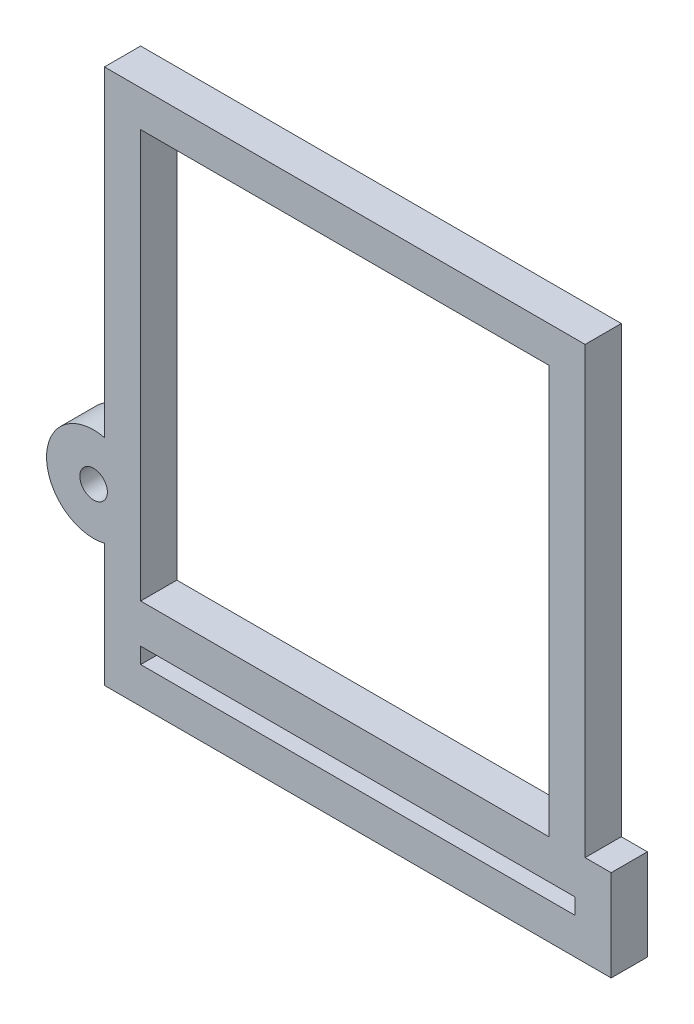
ISO-10303-21;
HEADER;
FILE_DESCRIPTION(('STEP AP214'),'2;1');
FILE_NAME('part.step','',(''),(''),'','','');
FILE_SCHEMA(('AUTOMOTIVE_DESIGN { 1 0 10303 214 1 1 1 1 }'));
ENDSEC;
DATA;
#1=APPLICATION_CONTEXT('core data for automotive mechanical design processes');
#2=APPLICATION_PROTOCOL_DEFINITION('international standard','automotive_design',2000,#1);
#3=PRODUCT_CONTEXT('',#1,'mechanical');
#4=PRODUCT('Part','Part','',(#3));
#5=PRODUCT_RELATED_PRODUCT_CATEGORY('part','',(#4));
#6=PRODUCT_DEFINITION_FORMATION('','',#4);
#7=PRODUCT_DEFINITION_CONTEXT('part definition',#1,'design');
#8=PRODUCT_DEFINITION('design','',#6,#7);
#9=PRODUCT_DEFINITION_SHAPE('','',#8);
#10=(LENGTH_UNIT() NAMED_UNIT(*) SI_UNIT(.MILLI.,.METRE.));
#11=(NAMED_UNIT(*) PLANE_ANGLE_UNIT() SI_UNIT($,.RADIAN.));
#12=(NAMED_UNIT(*) SI_UNIT($,.STERADIAN.) SOLID_ANGLE_UNIT());
#13=UNCERTAINTY_MEASURE_WITH_UNIT(LENGTH_MEASURE(1.E-05),#10,'distance_accuracy_value','');
#14=(GEOMETRIC_REPRESENTATION_CONTEXT(3) GLOBAL_UNCERTAINTY_ASSIGNED_CONTEXT((#13)) GLOBAL_UNIT_ASSIGNED_CONTEXT((#10,
#11,#12)) REPRESENTATION_CONTEXT('',''));
#15=CARTESIAN_POINT('',(0.,0.,0.));
#16=DIRECTION('',(0.,0.,1.));
#17=DIRECTION('',(1.,0.,0.));
#18=AXIS2_PLACEMENT_3D('',#15,#16,#17);
#19=CARTESIAN_POINT('',(0.,0.,5.));
#20=DIRECTION('',(1.,0.,0.));
#21=DIRECTION('',(0.,1.,0.));
#22=AXIS2_PLACEMENT_3D('',#19,#20,#21);
#23=PLANE('',#22);
#24=DIRECTION('',(0.,-1.,0.));
#25=VECTOR('',#24,1.);
#26=CARTESIAN_POINT('',(0.,0.,0.));
#27=LINE('',#26,#25);
#28=CARTESIAN_POINT('',(0.,74.,0.));
#29=VERTEX_POINT('',#28);
#30=CARTESIAN_POINT('',(0.,29.6536509361899,0.));
#31=VERTEX_POINT('',#30);
#32=EDGE_CURVE('E158',#29,#31,#27,.T.);
#33=ORIENTED_EDGE('',*,*,#32,.T.);
#34=DIRECTION('',(0.,0.,1.));
#35=VECTOR('',#34,1.);
#36=CARTESIAN_POINT('',(0.,29.6536509361899,-18.3847763108502));
#37=LINE('',#36,#35);
#38=CARTESIAN_POINT('',(0.,29.6536509361899,5.));
#39=VERTEX_POINT('',#38);
#40=EDGE_CURVE('E145',#31,#39,#37,.T.);
#41=ORIENTED_EDGE('',*,*,#40,.T.);
#42=DIRECTION('',(0.,-1.,0.));
#43=VECTOR('',#42,1.);
#44=CARTESIAN_POINT('',(0.,0.,5.));
#45=LINE('',#44,#43);
#46=CARTESIAN_POINT('',(0.,74.,5.));
#47=VERTEX_POINT('',#46);
#48=EDGE_CURVE('E156',#47,#39,#45,.T.);
#49=ORIENTED_EDGE('',*,*,#48,.F.);
#50=DIRECTION('',(0.,0.,-1.));
#51=VECTOR('',#50,1.);
#52=CARTESIAN_POINT('',(0.,74.,5.));
#53=LINE('',#52,#51);
#54=EDGE_CURVE('E180',#47,#29,#53,.T.);
#55=ORIENTED_EDGE('',*,*,#54,.T.);
#56=EDGE_LOOP('',(#33,#41,#49,#55));
#57=FACE_BOUND('',#56,.T.);
#58=ADVANCED_FACE('F31',(#57),#23,.F.);
#59=CARTESIAN_POINT('',(0.,17.0045402955164,5.));
#60=VERTEX_POINT('',#59);
#61=CARTESIAN_POINT('',(0.,0.,5.));
#62=VERTEX_POINT('',#61);
#63=EDGE_CURVE('E168',#60,#62,#45,.T.);
#64=ORIENTED_EDGE('',*,*,#63,.F.);
#65=DIRECTION('',(0.,0.,1.));
#66=VECTOR('',#65,1.);
#67=CARTESIAN_POINT('',(0.,17.0045402955164,-18.3847763108502));
#68=LINE('',#67,#66);
#69=CARTESIAN_POINT('',(0.,17.0045402955164,0.));
#70=VERTEX_POINT('',#69);
#71=EDGE_CURVE('E146',#60,#70,#68,.F.);
#72=ORIENTED_EDGE('',*,*,#71,.T.);
#73=CARTESIAN_POINT('',(0.,0.,0.));
#74=VERTEX_POINT('',#73);
#75=EDGE_CURVE('E183',#70,#74,#27,.T.);
#76=ORIENTED_EDGE('',*,*,#75,.T.);
#77=DIRECTION('',(0.,0.,-1.));
#78=VECTOR('',#77,1.);
#79=CARTESIAN_POINT('',(0.,0.,5.));
#80=LINE('',#79,#78);
#81=EDGE_CURVE('E193',#62,#74,#80,.T.);
#82=ORIENTED_EDGE('',*,*,#81,.F.);
#83=EDGE_LOOP('',(#64,#72,#76,#82));
#84=FACE_BOUND('',#83,.T.);
#85=ADVANCED_FACE('F33',(#84),#23,.F.);
#86=CARTESIAN_POINT('',(0.,0.,5.));
#87=DIRECTION('',(0.,1.,0.));
#88=DIRECTION('',(0.,0.,1.));
#89=AXIS2_PLACEMENT_3D('',#86,#87,#88);
#90=PLANE('',#89);
#91=DIRECTION('',(1.,0.,0.));
#92=VECTOR('',#91,1.);
#93=CARTESIAN_POINT('',(0.,0.,0.));
#94=LINE('',#93,#92);
#95=CARTESIAN_POINT('',(70.,0.,0.));
#96=VERTEX_POINT('',#95);
#97=EDGE_CURVE('E182',#74,#96,#94,.T.);
#98=ORIENTED_EDGE('',*,*,#97,.T.);
#99=DIRECTION('',(0.,0.,-1.));
#100=VECTOR('',#99,1.);
#101=CARTESIAN_POINT('',(70.,0.,5.));
#102=LINE('',#101,#100);
#103=CARTESIAN_POINT('',(70.,0.,5.));
#104=VERTEX_POINT('',#103);
#105=EDGE_CURVE('E190',#104,#96,#102,.T.);
#106=ORIENTED_EDGE('',*,*,#105,.F.);
#107=DIRECTION('',(1.,0.,0.));
#108=VECTOR('',#107,1.);
#109=CARTESIAN_POINT('',(0.,0.,5.));
#110=LINE('',#109,#108);
#111=EDGE_CURVE('E167',#62,#104,#110,.T.);
#112=ORIENTED_EDGE('',*,*,#111,.F.);
#113=ORIENTED_EDGE('',*,*,#81,.T.);
#114=EDGE_LOOP('',(#98,#106,#112,#113));
#115=FACE_BOUND('',#114,.T.);
#116=ADVANCED_FACE('F287',(#115),#90,.F.);
#117=CARTESIAN_POINT('',(70.,0.,5.));
#118=DIRECTION('',(-1.,0.,0.));
#119=DIRECTION('',(0.,-1.,0.));
#120=AXIS2_PLACEMENT_3D('',#117,#118,#119);
#121=PLANE('',#120);
#122=DIRECTION('',(0.,1.,0.));
#123=VECTOR('',#122,1.);
#124=CARTESIAN_POINT('',(70.,0.,0.));
#125=LINE('',#124,#123);
#126=CARTESIAN_POINT('',(70.,12.6,0.));
#127=VERTEX_POINT('',#126);
#128=EDGE_CURVE('E185',#96,#127,#125,.T.);
#129=ORIENTED_EDGE('',*,*,#128,.T.);
#130=DIRECTION('',(0.,0.,-1.));
#131=VECTOR('',#130,1.);
#132=CARTESIAN_POINT('',(70.,12.6,5.));
#133=LINE('',#132,#131);
#134=CARTESIAN_POINT('',(70.,12.6,5.));
#135=VERTEX_POINT('',#134);
#136=EDGE_CURVE('E54',#135,#127,#133,.T.);
#137=ORIENTED_EDGE('',*,*,#136,.F.);
#138=DIRECTION('',(0.,1.,0.));
#139=VECTOR('',#138,1.);
#140=CARTESIAN_POINT('',(70.,0.,5.));
#141=LINE('',#140,#139);
#142=EDGE_CURVE('E170',#104,#135,#141,.T.);
#143=ORIENTED_EDGE('',*,*,#142,.F.);
#144=ORIENTED_EDGE('',*,*,#105,.T.);
#145=EDGE_LOOP('',(#129,#137,#143,#144));
#146=FACE_BOUND('',#145,.T.);
#147=ADVANCED_FACE('F292',(#146),#121,.F.);
#148=CARTESIAN_POINT('',(0.,74.,5.));
#149=DIRECTION('',(0.,-1.,0.));
#150=DIRECTION('',(0.,0.,-1.));
#151=AXIS2_PLACEMENT_3D('',#148,#149,#150);
#152=PLANE('',#151);
#153=DIRECTION('',(-1.,0.,0.));
#154=VECTOR('',#153,1.);
#155=CARTESIAN_POINT('',(0.,74.,5.));
#156=LINE('',#155,#154);
#157=CARTESIAN_POINT('',(66.4,74.,5.));
#158=VERTEX_POINT('',#157);
#159=EDGE_CURVE('E165',#158,#47,#156,.T.);
#160=ORIENTED_EDGE('',*,*,#159,.F.);
#161=DIRECTION('',(0.,0.,-1.));
#162=VECTOR('',#161,1.);
#163=CARTESIAN_POINT('',(66.4,74.,5.));
#164=LINE('',#163,#162);
#165=CARTESIAN_POINT('',(66.4,74.,0.));
#166=VERTEX_POINT('',#165);
#167=EDGE_CURVE('E296',#158,#166,#164,.T.);
#168=ORIENTED_EDGE('',*,*,#167,.T.);
#169=DIRECTION('',(-1.,0.,0.));
#170=VECTOR('',#169,1.);
#171=CARTESIAN_POINT('',(0.,74.,0.));
#172=LINE('',#171,#170);
#173=EDGE_CURVE('E172',#166,#29,#172,.T.);
#174=ORIENTED_EDGE('',*,*,#173,.T.);
#175=ORIENTED_EDGE('',*,*,#54,.F.);
#176=EDGE_LOOP('',(#160,#168,#174,#175));
#177=FACE_BOUND('',#176,.T.);
#178=ADVANCED_FACE('F307',(#177),#152,.F.);
#179=CARTESIAN_POINT('',(0.,74.,5.));
#180=DIRECTION('',(0.,0.,-1.));
#181=DIRECTION('',(-1.,0.,0.));
#182=AXIS2_PLACEMENT_3D('',#179,#180,#181);
#183=PLANE('',#182);
#184=CARTESIAN_POINT('',(-1.50000000000004,23.3290956158532,5.));
#185=DIRECTION('',(0.,0.,1.));
#186=DIRECTION('',(1.,0.,0.));
#187=AXIS2_PLACEMENT_3D('',#184,#185,#186);
#188=CIRCLE('',#187,1.9);
#189=CARTESIAN_POINT('',(0.399999999999964,23.3290956158532,5.));
#190=VERTEX_POINT('',#189);
#191=EDGE_CURVE('E150',#190,#190,#188,.T.);
#192=ORIENTED_EDGE('',*,*,#191,.F.);
#193=EDGE_LOOP('',(#192));
#194=FACE_BOUND('',#193,.T.);
#195=DIRECTION('',(1.,0.,0.));
#196=VECTOR('',#195,1.);
#197=CARTESIAN_POINT('',(4.99999999999997,12.6,5.));
#198=LINE('',#197,#196);
#199=CARTESIAN_POINT('',(4.99999999999997,12.6,5.));
#200=VERTEX_POINT('',#199);
#201=CARTESIAN_POINT('',(61.4,12.6,5.));
#202=VERTEX_POINT('',#201);
#203=EDGE_CURVE('E302',#200,#202,#198,.T.);
#204=ORIENTED_EDGE('',*,*,#203,.F.);
#205=DIRECTION('',(0.,-1.,0.));
#206=VECTOR('',#205,1.);
#207=CARTESIAN_POINT('',(4.99999999999996,69.,5.));
#208=LINE('',#207,#206);
#209=CARTESIAN_POINT('',(4.99999999999996,69.,5.));
#210=VERTEX_POINT('',#209);
#211=EDGE_CURVE('E232',#210,#200,#208,.T.);
#212=ORIENTED_EDGE('',*,*,#211,.F.);
#213=DIRECTION('',(-1.,0.,0.));
#214=VECTOR('',#213,1.);
#215=CARTESIAN_POINT('',(4.99999999999996,69.,5.));
#216=LINE('',#215,#214);
#217=CARTESIAN_POINT('',(61.4,69.,5.));
#218=VERTEX_POINT('',#217);
#219=EDGE_CURVE('E233',#218,#210,#216,.T.);
#220=ORIENTED_EDGE('',*,*,#219,.F.);
#221=DIRECTION('',(0.,1.,0.));
#222=VECTOR('',#221,1.);
#223=CARTESIAN_POINT('',(61.4,69.,5.));
#224=LINE('',#223,#222);
#225=EDGE_CURVE('E216',#202,#218,#224,.T.);
#226=ORIENTED_EDGE('',*,*,#225,.F.);
#227=EDGE_LOOP('',(#204,#212,#220,#226));
#228=FACE_BOUND('',#227,.T.);
#229=ORIENTED_EDGE('',*,*,#48,.T.);
#230=CARTESIAN_POINT('',(-1.50000000000004,23.3290956158532,5.));
#231=DIRECTION('',(0.,0.,1.));
#232=DIRECTION('',(1.,0.,0.));
#233=AXIS2_PLACEMENT_3D('',#230,#231,#232);
#234=CIRCLE('',#233,6.5);
#235=EDGE_CURVE('E142',#39,#60,#234,.T.);
#236=ORIENTED_EDGE('',*,*,#235,.T.);
#237=ORIENTED_EDGE('',*,*,#63,.T.);
#238=ORIENTED_EDGE('',*,*,#111,.T.);
#239=ORIENTED_EDGE('',*,*,#142,.T.);
#240=DIRECTION('',(-1.,0.,0.));
#241=VECTOR('',#240,1.);
#242=CARTESIAN_POINT('',(70.,12.6,5.));
#243=LINE('',#242,#241);
#244=CARTESIAN_POINT('',(66.3999999999999,12.6,5.));
#245=VERTEX_POINT('',#244);
#246=EDGE_CURVE('E290',#135,#245,#243,.T.);
#247=ORIENTED_EDGE('',*,*,#246,.T.);
#248=DIRECTION('',(0.,1.,0.));
#249=VECTOR('',#248,1.);
#250=CARTESIAN_POINT('',(66.4,74.,5.));
#251=LINE('',#250,#249);
#252=EDGE_CURVE('E294',#245,#158,#251,.T.);
#253=ORIENTED_EDGE('',*,*,#252,.T.);
#254=ORIENTED_EDGE('',*,*,#159,.T.);
#255=EDGE_LOOP('',(#229,#236,#237,#238,#239,#247,#253,#254));
#256=FACE_BOUND('',#255,.T.);
#257=DIRECTION('',(1.,0.,0.));
#258=VECTOR('',#257,1.);
#259=CARTESIAN_POINT('',(5.,5.,5.));
#260=LINE('',#259,#258);
#261=CARTESIAN_POINT('',(5.,5.,5.));
#262=VERTEX_POINT('',#261);
#263=CARTESIAN_POINT('',(65.,5.,5.));
#264=VERTEX_POINT('',#263);
#265=EDGE_CURVE('E249',#262,#264,#260,.T.);
#266=ORIENTED_EDGE('',*,*,#265,.F.);
#267=DIRECTION('',(0.,-1.,0.));
#268=VECTOR('',#267,1.);
#269=CARTESIAN_POINT('',(5.,7.2,5.));
#270=LINE('',#269,#268);
#271=CARTESIAN_POINT('',(5.,7.2,5.));
#272=VERTEX_POINT('',#271);
#273=EDGE_CURVE('E247',#272,#262,#270,.T.);
#274=ORIENTED_EDGE('',*,*,#273,.F.);
#275=DIRECTION('',(-1.,0.,0.));
#276=VECTOR('',#275,1.);
#277=CARTESIAN_POINT('',(5.,7.2,5.));
#278=LINE('',#277,#276);
#279=CARTESIAN_POINT('',(65.,7.2,5.));
#280=VERTEX_POINT('',#279);
#281=EDGE_CURVE('E255',#280,#272,#278,.T.);
#282=ORIENTED_EDGE('',*,*,#281,.F.);
#283=DIRECTION('',(0.,1.,0.));
#284=VECTOR('',#283,1.);
#285=CARTESIAN_POINT('',(65.,7.2,5.));
#286=LINE('',#285,#284);
#287=EDGE_CURVE('E252',#264,#280,#286,.T.);
#288=ORIENTED_EDGE('',*,*,#287,.F.);
#289=EDGE_LOOP('',(#266,#274,#282,#288));
#290=FACE_BOUND('',#289,.T.);
#291=ADVANCED_FACE('F161',(#194,#228,#256,#290),#183,.F.);
#292=CARTESIAN_POINT('',(0.,74.,0.));
#293=DIRECTION('',(0.,0.,-1.));
#294=DIRECTION('',(-1.,0.,0.));
#295=AXIS2_PLACEMENT_3D('',#292,#293,#294);
#296=PLANE('',#295);
#297=CARTESIAN_POINT('',(-1.50000000000004,23.3290956158532,0.));
#298=DIRECTION('',(0.,0.,-1.));
#299=DIRECTION('',(-1.,0.,0.));
#300=AXIS2_PLACEMENT_3D('',#297,#298,#299);
#301=CIRCLE('',#300,1.9);
#302=CARTESIAN_POINT('',(-3.40000000000004,23.3290956158532,0.));
#303=VERTEX_POINT('',#302);
#304=EDGE_CURVE('E478',#303,#303,#301,.F.);
#305=ORIENTED_EDGE('',*,*,#304,.T.);
#306=EDGE_LOOP('',(#305));
#307=FACE_BOUND('',#306,.T.);
#308=DIRECTION('',(1.,0.,0.));
#309=VECTOR('',#308,1.);
#310=CARTESIAN_POINT('',(0.,69.,0.));
#311=LINE('',#310,#309);
#312=CARTESIAN_POINT('',(4.99999999999996,69.,0.));
#313=VERTEX_POINT('',#312);
#314=CARTESIAN_POINT('',(61.4,69.,0.));
#315=VERTEX_POINT('',#314);
#316=EDGE_CURVE('E39',#313,#315,#311,.T.);
#317=ORIENTED_EDGE('',*,*,#316,.F.);
#318=DIRECTION('',(0.,1.,0.));
#319=VECTOR('',#318,1.);
#320=CARTESIAN_POINT('',(4.99999999999996,74.,0.));
#321=LINE('',#320,#319);
#322=CARTESIAN_POINT('',(4.99999999999997,12.6,0.));
#323=VERTEX_POINT('',#322);
#324=EDGE_CURVE('E11',#323,#313,#321,.T.);
#325=ORIENTED_EDGE('',*,*,#324,.F.);
#326=DIRECTION('',(-1.,0.,0.));
#327=VECTOR('',#326,1.);
#328=CARTESIAN_POINT('',(0.,12.6,0.));
#329=LINE('',#328,#327);
#330=CARTESIAN_POINT('',(61.4,12.6,0.));
#331=VERTEX_POINT('',#330);
#332=EDGE_CURVE('E196',#331,#323,#329,.T.);
#333=ORIENTED_EDGE('',*,*,#332,.F.);
#334=DIRECTION('',(0.,-1.,0.));
#335=VECTOR('',#334,1.);
#336=CARTESIAN_POINT('',(61.4,74.,0.));
#337=LINE('',#336,#335);
#338=EDGE_CURVE('E198',#315,#331,#337,.T.);
#339=ORIENTED_EDGE('',*,*,#338,.F.);
#340=EDGE_LOOP('',(#317,#325,#333,#339));
#341=FACE_BOUND('',#340,.T.);
#342=ORIENTED_EDGE('',*,*,#75,.F.);
#343=CARTESIAN_POINT('',(-1.50000000000004,23.3290956158532,0.));
#344=DIRECTION('',(0.,0.,-1.));
#345=DIRECTION('',(-1.,0.,0.));
#346=AXIS2_PLACEMENT_3D('',#343,#344,#345);
#347=CIRCLE('',#346,6.5);
#348=EDGE_CURVE('E46',#31,#70,#347,.F.);
#349=ORIENTED_EDGE('',*,*,#348,.F.);
#350=ORIENTED_EDGE('',*,*,#32,.F.);
#351=ORIENTED_EDGE('',*,*,#173,.F.);
#352=DIRECTION('',(0.,1.,0.));
#353=VECTOR('',#352,1.);
#354=CARTESIAN_POINT('',(66.4,74.,0.));
#355=LINE('',#354,#353);
#356=CARTESIAN_POINT('',(66.3999999999999,12.6,0.));
#357=VERTEX_POINT('',#356);
#358=EDGE_CURVE('E485',#357,#166,#355,.T.);
#359=ORIENTED_EDGE('',*,*,#358,.F.);
#360=DIRECTION('',(-1.,0.,0.));
#361=VECTOR('',#360,1.);
#362=CARTESIAN_POINT('',(70.,12.6,0.));
#363=LINE('',#362,#361);
#364=EDGE_CURVE('E159',#127,#357,#363,.T.);
#365=ORIENTED_EDGE('',*,*,#364,.F.);
#366=ORIENTED_EDGE('',*,*,#128,.F.);
#367=ORIENTED_EDGE('',*,*,#97,.F.);
#368=EDGE_LOOP('',(#342,#349,#350,#351,#359,#365,#366,#367));
#369=FACE_BOUND('',#368,.T.);
#370=DIRECTION('',(0.,-1.,0.));
#371=VECTOR('',#370,1.);
#372=CARTESIAN_POINT('',(5.,7.2,0.));
#373=LINE('',#372,#371);
#374=CARTESIAN_POINT('',(5.,7.2,0.));
#375=VERTEX_POINT('',#374);
#376=CARTESIAN_POINT('',(5.,5.,0.));
#377=VERTEX_POINT('',#376);
#378=EDGE_CURVE('E244',#375,#377,#373,.T.);
#379=ORIENTED_EDGE('',*,*,#378,.T.);
#380=DIRECTION('',(1.,0.,0.));
#381=VECTOR('',#380,1.);
#382=CARTESIAN_POINT('',(5.,5.,0.));
#383=LINE('',#382,#381);
#384=CARTESIAN_POINT('',(65.,5.,0.));
#385=VERTEX_POINT('',#384);
#386=EDGE_CURVE('E174',#377,#385,#383,.T.);
#387=ORIENTED_EDGE('',*,*,#386,.T.);
#388=DIRECTION('',(0.,1.,0.));
#389=VECTOR('',#388,1.);
#390=CARTESIAN_POINT('',(65.,7.2,0.));
#391=LINE('',#390,#389);
#392=CARTESIAN_POINT('',(65.,7.2,0.));
#393=VERTEX_POINT('',#392);
#394=EDGE_CURVE('E238',#385,#393,#391,.T.);
#395=ORIENTED_EDGE('',*,*,#394,.T.);
#396=DIRECTION('',(-1.,0.,0.));
#397=VECTOR('',#396,1.);
#398=CARTESIAN_POINT('',(5.,7.2,0.));
#399=LINE('',#398,#397);
#400=EDGE_CURVE('E241',#393,#375,#399,.T.);
#401=ORIENTED_EDGE('',*,*,#400,.T.);
#402=EDGE_LOOP('',(#379,#387,#395,#401));
#403=FACE_BOUND('',#402,.T.);
#404=ADVANCED_FACE('F220',(#307,#341,#369,#403),#296,.T.);
#405=CARTESIAN_POINT('',(5.,7.2,-0.00100000000000013));
#406=DIRECTION('',(-1.,0.,0.));
#407=DIRECTION('',(0.,0.,1.));
#408=AXIS2_PLACEMENT_3D('',#405,#406,#407);
#409=PLANE('',#408);
#410=DIRECTION('',(0.,0.,1.));
#411=VECTOR('',#410,1.);
#412=CARTESIAN_POINT('',(5.,7.2,-0.00100000000000013));
#413=LINE('',#412,#411);
#414=EDGE_CURVE('E259',#375,#272,#413,.T.);
#415=ORIENTED_EDGE('',*,*,#414,.T.);
#416=ORIENTED_EDGE('',*,*,#273,.T.);
#417=DIRECTION('',(0.,0.,1.));
#418=VECTOR('',#417,1.);
#419=CARTESIAN_POINT('',(5.,5.,-0.00100000000000013));
#420=LINE('',#419,#418);
#421=EDGE_CURVE('E258',#377,#262,#420,.T.);
#422=ORIENTED_EDGE('',*,*,#421,.F.);
#423=ORIENTED_EDGE('',*,*,#378,.F.);
#424=EDGE_LOOP('',(#415,#416,#422,#423));
#425=FACE_BOUND('',#424,.T.);
#426=ADVANCED_FACE('F314',(#425),#409,.F.);
#427=CARTESIAN_POINT('',(5.,7.2,-0.00100000000000013));
#428=DIRECTION('',(0.,1.,0.));
#429=DIRECTION('',(0.,0.,1.));
#430=AXIS2_PLACEMENT_3D('',#427,#428,#429);
#431=PLANE('',#430);
#432=DIRECTION('',(0.,0.,1.));
#433=VECTOR('',#432,1.);
#434=CARTESIAN_POINT('',(65.,7.2,-0.00100000000000013));
#435=LINE('',#434,#433);
#436=EDGE_CURVE('E261',#393,#280,#435,.T.);
#437=ORIENTED_EDGE('',*,*,#436,.T.);
#438=ORIENTED_EDGE('',*,*,#281,.T.);
#439=ORIENTED_EDGE('',*,*,#414,.F.);
#440=ORIENTED_EDGE('',*,*,#400,.F.);
#441=EDGE_LOOP('',(#437,#438,#439,#440));
#442=FACE_BOUND('',#441,.T.);
#443=ADVANCED_FACE('F423',(#442),#431,.F.);
#444=CARTESIAN_POINT('',(65.,7.2,-0.00100000000000013));
#445=DIRECTION('',(1.,0.,0.));
#446=DIRECTION('',(0.,0.,-1.));
#447=AXIS2_PLACEMENT_3D('',#444,#445,#446);
#448=PLANE('',#447);
#449=DIRECTION('',(0.,0.,1.));
#450=VECTOR('',#449,1.);
#451=CARTESIAN_POINT('',(65.,5.,-0.00100000000000013));
#452=LINE('',#451,#450);
#453=EDGE_CURVE('E263',#385,#264,#452,.T.);
#454=ORIENTED_EDGE('',*,*,#453,.T.);
#455=ORIENTED_EDGE('',*,*,#287,.T.);
#456=ORIENTED_EDGE('',*,*,#436,.F.);
#457=ORIENTED_EDGE('',*,*,#394,.F.);
#458=EDGE_LOOP('',(#454,#455,#456,#457));
#459=FACE_BOUND('',#458,.T.);
#460=ADVANCED_FACE('F276',(#459),#448,.F.);
#461=CARTESIAN_POINT('',(5.,5.,-0.00100000000000013));
#462=DIRECTION('',(0.,-1.,0.));
#463=DIRECTION('',(0.,0.,-1.));
#464=AXIS2_PLACEMENT_3D('',#461,#462,#463);
#465=PLANE('',#464);
#466=ORIENTED_EDGE('',*,*,#421,.T.);
#467=ORIENTED_EDGE('',*,*,#265,.T.);
#468=ORIENTED_EDGE('',*,*,#453,.F.);
#469=ORIENTED_EDGE('',*,*,#386,.F.);
#470=EDGE_LOOP('',(#466,#467,#468,#469));
#471=FACE_BOUND('',#470,.T.);
#472=ADVANCED_FACE('F268',(#471),#465,.F.);
#473=CARTESIAN_POINT('',(4.99999999999996,69.,-15.));
#474=DIRECTION('',(-1.,0.,0.));
#475=DIRECTION('',(0.,-1.,0.));
#476=AXIS2_PLACEMENT_3D('',#473,#474,#475);
#477=PLANE('',#476);
#478=ORIENTED_EDGE('',*,*,#324,.T.);
#479=DIRECTION('',(0.,0.,1.));
#480=VECTOR('',#479,1.);
#481=CARTESIAN_POINT('',(4.99999999999996,69.,-15.));
#482=LINE('',#481,#480);
#483=EDGE_CURVE('E208',#313,#210,#482,.T.);
#484=ORIENTED_EDGE('',*,*,#483,.T.);
#485=ORIENTED_EDGE('',*,*,#211,.T.);
#486=DIRECTION('',(0.,0.,1.));
#487=VECTOR('',#486,1.);
#488=CARTESIAN_POINT('',(4.99999999999997,12.6,-15.));
#489=LINE('',#488,#487);
#490=EDGE_CURVE('E227',#323,#200,#489,.T.);
#491=ORIENTED_EDGE('',*,*,#490,.F.);
#492=EDGE_LOOP('',(#478,#484,#485,#491));
#493=FACE_BOUND('',#492,.T.);
#494=ADVANCED_FACE('F230',(#493),#477,.F.);
#495=CARTESIAN_POINT('',(4.99999999999996,69.,-15.));
#496=DIRECTION('',(0.,1.,0.));
#497=DIRECTION('',(0.,0.,1.));
#498=AXIS2_PLACEMENT_3D('',#495,#496,#497);
#499=PLANE('',#498);
#500=ORIENTED_EDGE('',*,*,#316,.T.);
#501=DIRECTION('',(0.,0.,1.));
#502=VECTOR('',#501,1.);
#503=CARTESIAN_POINT('',(61.4,69.,-15.));
#504=LINE('',#503,#502);
#505=EDGE_CURVE('E206',#315,#218,#504,.T.);
#506=ORIENTED_EDGE('',*,*,#505,.T.);
#507=ORIENTED_EDGE('',*,*,#219,.T.);
#508=ORIENTED_EDGE('',*,*,#483,.F.);
#509=EDGE_LOOP('',(#500,#506,#507,#508));
#510=FACE_BOUND('',#509,.T.);
#511=ADVANCED_FACE('F204',(#510),#499,.F.);
#512=CARTESIAN_POINT('',(61.4,69.,-15.));
#513=DIRECTION('',(1.,0.,0.));
#514=DIRECTION('',(0.,1.,0.));
#515=AXIS2_PLACEMENT_3D('',#512,#513,#514);
#516=PLANE('',#515);
#517=ORIENTED_EDGE('',*,*,#338,.T.);
#518=DIRECTION('',(0.,0.,1.));
#519=VECTOR('',#518,1.);
#520=CARTESIAN_POINT('',(61.4,12.6,-15.));
#521=LINE('',#520,#519);
#522=EDGE_CURVE('E218',#331,#202,#521,.T.);
#523=ORIENTED_EDGE('',*,*,#522,.T.);
#524=ORIENTED_EDGE('',*,*,#225,.T.);
#525=ORIENTED_EDGE('',*,*,#505,.F.);
#526=EDGE_LOOP('',(#517,#523,#524,#525));
#527=FACE_BOUND('',#526,.T.);
#528=ADVANCED_FACE('F213',(#527),#516,.F.);
#529=CARTESIAN_POINT('',(4.99999999999997,12.6,-15.));
#530=DIRECTION('',(0.,-1.,0.));
#531=DIRECTION('',(0.,0.,-1.));
#532=AXIS2_PLACEMENT_3D('',#529,#530,#531);
#533=PLANE('',#532);
#534=ORIENTED_EDGE('',*,*,#332,.T.);
#535=ORIENTED_EDGE('',*,*,#490,.T.);
#536=ORIENTED_EDGE('',*,*,#203,.T.);
#537=ORIENTED_EDGE('',*,*,#522,.F.);
#538=EDGE_LOOP('',(#534,#535,#536,#537));
#539=FACE_BOUND('',#538,.T.);
#540=ADVANCED_FACE('F225',(#539),#533,.F.);
#541=CARTESIAN_POINT('',(66.4,74.,5.));
#542=DIRECTION('',(-1.,0.,0.));
#543=DIRECTION('',(0.,-1.,0.));
#544=AXIS2_PLACEMENT_3D('',#541,#542,#543);
#545=PLANE('',#544);
#546=ORIENTED_EDGE('',*,*,#358,.T.);
#547=ORIENTED_EDGE('',*,*,#167,.F.);
#548=ORIENTED_EDGE('',*,*,#252,.F.);
#549=DIRECTION('',(0.,0.,-1.));
#550=VECTOR('',#549,1.);
#551=CARTESIAN_POINT('',(66.3999999999999,12.6,5.));
#552=LINE('',#551,#550);
#553=EDGE_CURVE('E293',#245,#357,#552,.T.);
#554=ORIENTED_EDGE('',*,*,#553,.T.);
#555=EDGE_LOOP('',(#546,#547,#548,#554));
#556=FACE_BOUND('',#555,.T.);
#557=ADVANCED_FACE('F345',(#556),#545,.F.);
#558=CARTESIAN_POINT('',(70.,12.6,5.));
#559=DIRECTION('',(0.,-1.,0.));
#560=DIRECTION('',(0.,0.,-1.));
#561=AXIS2_PLACEMENT_3D('',#558,#559,#560);
#562=PLANE('',#561);
#563=ORIENTED_EDGE('',*,*,#364,.T.);
#564=ORIENTED_EDGE('',*,*,#553,.F.);
#565=ORIENTED_EDGE('',*,*,#246,.F.);
#566=ORIENTED_EDGE('',*,*,#136,.T.);
#567=EDGE_LOOP('',(#563,#564,#565,#566));
#568=FACE_BOUND('',#567,.T.);
#569=ADVANCED_FACE('F350',(#568),#562,.F.);
#570=CARTESIAN_POINT('',(-1.50000000000004,23.3290956158532,-18.3847763108502));
#571=DIRECTION('',(0.,0.,1.));
#572=DIRECTION('',(1.,0.,0.));
#573=AXIS2_PLACEMENT_3D('',#570,#571,#572);
#574=CYLINDRICAL_SURFACE('',#573,6.5);
#575=ORIENTED_EDGE('',*,*,#40,.F.);
#576=ORIENTED_EDGE('',*,*,#348,.T.);
#577=ORIENTED_EDGE('',*,*,#71,.F.);
#578=ORIENTED_EDGE('',*,*,#235,.F.);
#579=EDGE_LOOP('',(#575,#576,#577,#578));
#580=FACE_BOUND('',#579,.T.);
#581=ADVANCED_FACE('F144',(#580),#574,.T.);
#582=CARTESIAN_POINT('',(-1.50000000000004,23.3290956158532,-0.00100000000000013));
#583=DIRECTION('',(0.,0.,1.));
#584=DIRECTION('',(1.,0.,0.));
#585=AXIS2_PLACEMENT_3D('',#582,#583,#584);
#586=CYLINDRICAL_SURFACE('',#585,1.9);
#587=ORIENTED_EDGE('',*,*,#304,.F.);
#588=EDGE_LOOP('',(#587));
#589=FACE_BOUND('',#588,.T.);
#590=ORIENTED_EDGE('',*,*,#191,.T.);
#591=EDGE_LOOP('',(#590));
#592=FACE_BOUND('',#591,.T.);
#593=ADVANCED_FACE('F391',(#589,#592),#586,.F.);
#594=CLOSED_SHELL('',(#58,#85,#116,#147,#178,#291,#404,#426,#443,#460,#472,#494,#511,#528,#540,
#557,#569,#581,#593));
#595=MANIFOLD_SOLID_BREP('B2',#594);
#596=ADVANCED_BREP_SHAPE_REPRESENTATION('',(#18,#595),#14);
#597=SHAPE_DEFINITION_REPRESENTATION(#9,#596);
ENDSEC;
END-ISO-10303-21;
